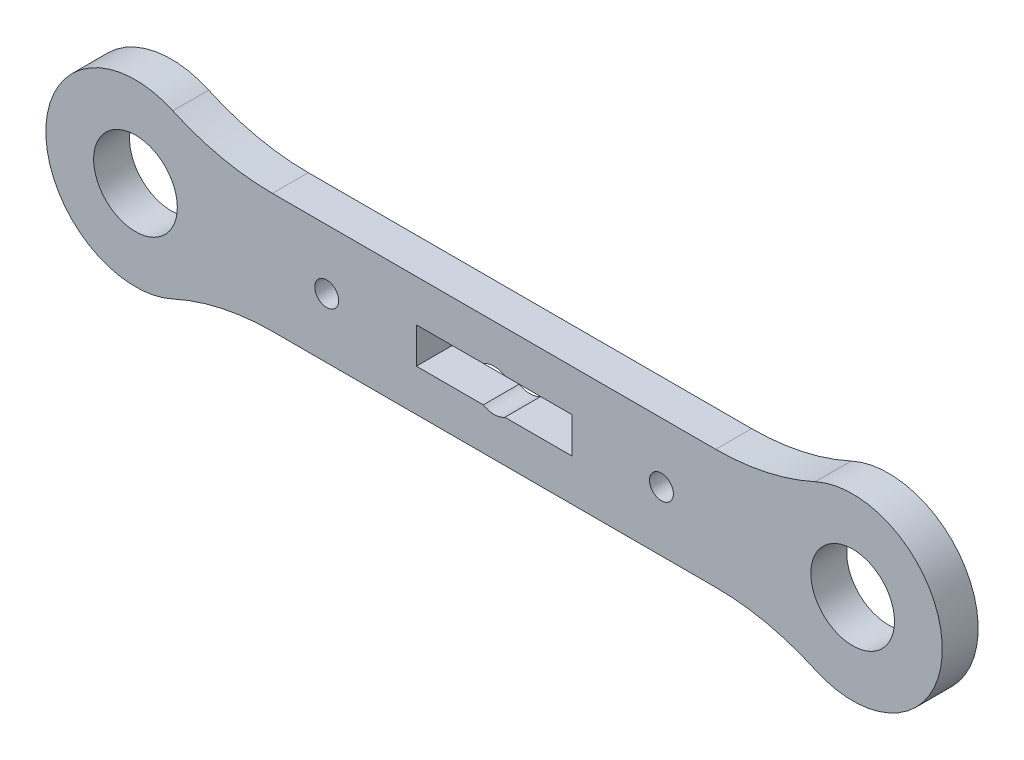
ISO-10303-21;
HEADER;
FILE_DESCRIPTION(('STEP AP214'),'2;1');
FILE_NAME('part.step','',(''),(''),'','','');
FILE_SCHEMA(('AUTOMOTIVE_DESIGN { 1 0 10303 214 1 1 1 1 }'));
ENDSEC;
DATA;
#1=APPLICATION_CONTEXT('core data for automotive mechanical design processes');
#2=APPLICATION_PROTOCOL_DEFINITION('international standard','automotive_design',2000,#1);
#3=PRODUCT_CONTEXT('',#1,'mechanical');
#4=PRODUCT('Part','Part','',(#3));
#5=PRODUCT_RELATED_PRODUCT_CATEGORY('part','',(#4));
#6=PRODUCT_DEFINITION_FORMATION('','',#4);
#7=PRODUCT_DEFINITION_CONTEXT('part definition',#1,'design');
#8=PRODUCT_DEFINITION('design','',#6,#7);
#9=PRODUCT_DEFINITION_SHAPE('','',#8);
#10=(LENGTH_UNIT() NAMED_UNIT(*) SI_UNIT(.MILLI.,.METRE.));
#11=(NAMED_UNIT(*) PLANE_ANGLE_UNIT() SI_UNIT($,.RADIAN.));
#12=(NAMED_UNIT(*) SI_UNIT($,.STERADIAN.) SOLID_ANGLE_UNIT());
#13=UNCERTAINTY_MEASURE_WITH_UNIT(LENGTH_MEASURE(1.E-05),#10,'distance_accuracy_value','');
#14=(GEOMETRIC_REPRESENTATION_CONTEXT(3) GLOBAL_UNCERTAINTY_ASSIGNED_CONTEXT((#13)) GLOBAL_UNIT_ASSIGNED_CONTEXT((#10,
#11,#12)) REPRESENTATION_CONTEXT('',''));
#15=CARTESIAN_POINT('',(0.,0.,0.));
#16=DIRECTION('',(0.,0.,1.));
#17=DIRECTION('',(1.,0.,0.));
#18=AXIS2_PLACEMENT_3D('',#15,#16,#17);
#19=CARTESIAN_POINT('',(60.,0.,3.));
#20=DIRECTION('',(0.,0.,-1.));
#21=DIRECTION('',(-1.,0.,0.));
#22=AXIS2_PLACEMENT_3D('',#19,#20,#21);
#23=CYLINDRICAL_SURFACE('',#22,7.5);
#24=CARTESIAN_POINT('',(60.,0.,3.));
#25=DIRECTION('',(0.,0.,1.));
#26=DIRECTION('',(1.,0.,0.));
#27=AXIS2_PLACEMENT_3D('',#24,#25,#26);
#28=CIRCLE('',#27,7.5);
#29=CARTESIAN_POINT('',(56.875516571621,6.81818181818182,3.));
#30=VERTEX_POINT('',#29);
#31=CARTESIAN_POINT('',(56.875516571621,-6.81818181818181,3.));
#32=VERTEX_POINT('',#31);
#33=EDGE_CURVE('E200',#30,#32,#28,.F.);
#34=ORIENTED_EDGE('',*,*,#33,.T.);
#35=DIRECTION('',(0.,0.,-1.));
#36=VECTOR('',#35,1.);
#37=CARTESIAN_POINT('',(56.875516571621,-6.81818181818181,3.));
#38=LINE('',#37,#36);
#39=CARTESIAN_POINT('',(56.875516571621,-6.81818181818181,0.));
#40=VERTEX_POINT('',#39);
#41=EDGE_CURVE('E283',#32,#40,#38,.T.);
#42=ORIENTED_EDGE('',*,*,#41,.T.);
#43=CARTESIAN_POINT('',(60.,0.,0.));
#44=DIRECTION('',(0.,0.,1.));
#45=DIRECTION('',(1.,0.,0.));
#46=AXIS2_PLACEMENT_3D('',#43,#44,#45);
#47=CIRCLE('',#46,7.5);
#48=CARTESIAN_POINT('',(56.875516571621,6.81818181818182,0.));
#49=VERTEX_POINT('',#48);
#50=EDGE_CURVE('E245',#49,#40,#47,.F.);
#51=ORIENTED_EDGE('',*,*,#50,.F.);
#52=DIRECTION('',(0.,0.,-1.));
#53=VECTOR('',#52,1.);
#54=CARTESIAN_POINT('',(56.875516571621,6.81818181818182,3.));
#55=LINE('',#54,#53);
#56=EDGE_CURVE('E281',#49,#30,#55,.F.);
#57=ORIENTED_EDGE('',*,*,#56,.T.);
#58=EDGE_LOOP('',(#34,#42,#51,#57));
#59=FACE_BOUND('',#58,.T.);
#60=ADVANCED_FACE('F35',(#59),#23,.T.);
#61=CARTESIAN_POINT('',(0.,5.,3.));
#62=DIRECTION('',(0.,1.,0.));
#63=DIRECTION('',(-1.,0.,0.));
#64=AXIS2_PLACEMENT_3D('',#61,#62,#63);
#65=PLANE('',#64);
#66=DIRECTION('',(1.,0.,0.));
#67=VECTOR('',#66,1.);
#68=CARTESIAN_POINT('',(0.,5.,3.));
#69=LINE('',#68,#67);
#70=CARTESIAN_POINT('',(11.4564392373896,5.,3.));
#71=VERTEX_POINT('',#70);
#72=CARTESIAN_POINT('',(48.5435607626104,5.00000000000001,3.));
#73=VERTEX_POINT('',#72);
#74=EDGE_CURVE('E203',#71,#73,#69,.T.);
#75=ORIENTED_EDGE('',*,*,#74,.T.);
#76=DIRECTION('',(0.,0.,1.));
#77=VECTOR('',#76,1.);
#78=CARTESIAN_POINT('',(48.5435607626104,5.00000000000001,0.));
#79=LINE('',#78,#77);
#80=CARTESIAN_POINT('',(48.5435607626104,5.00000000000001,0.));
#81=VERTEX_POINT('',#80);
#82=EDGE_CURVE('E287',#73,#81,#79,.F.);
#83=ORIENTED_EDGE('',*,*,#82,.T.);
#84=DIRECTION('',(1.,0.,0.));
#85=VECTOR('',#84,1.);
#86=CARTESIAN_POINT('',(0.,5.,0.));
#87=LINE('',#86,#85);
#88=CARTESIAN_POINT('',(11.4564392373896,5.,0.));
#89=VERTEX_POINT('',#88);
#90=EDGE_CURVE('E248',#89,#81,#87,.T.);
#91=ORIENTED_EDGE('',*,*,#90,.F.);
#92=DIRECTION('',(0.,0.,-1.));
#93=VECTOR('',#92,1.);
#94=CARTESIAN_POINT('',(11.4564392373896,5.,3.));
#95=LINE('',#94,#93);
#96=EDGE_CURVE('E57',#89,#71,#95,.F.);
#97=ORIENTED_EDGE('',*,*,#96,.T.);
#98=EDGE_LOOP('',(#75,#83,#91,#97));
#99=FACE_BOUND('',#98,.T.);
#100=ADVANCED_FACE('F306',(#99),#65,.T.);
#101=CARTESIAN_POINT('',(0.,0.,3.));
#102=DIRECTION('',(0.,0.,-1.));
#103=DIRECTION('',(-1.,0.,0.));
#104=AXIS2_PLACEMENT_3D('',#101,#102,#103);
#105=CYLINDRICAL_SURFACE('',#104,7.5);
#106=CARTESIAN_POINT('',(0.,0.,0.));
#107=DIRECTION('',(0.,0.,1.));
#108=DIRECTION('',(1.,0.,0.));
#109=AXIS2_PLACEMENT_3D('',#106,#107,#108);
#110=CIRCLE('',#109,7.5);
#111=CARTESIAN_POINT('',(3.12448342837898,6.81818181818182,0.));
#112=VERTEX_POINT('',#111);
#113=CARTESIAN_POINT('',(3.12448342837898,-6.81818181818182,0.));
#114=VERTEX_POINT('',#113);
#115=EDGE_CURVE('E251',#112,#114,#110,.T.);
#116=ORIENTED_EDGE('',*,*,#115,.T.);
#117=DIRECTION('',(0.,0.,-1.));
#118=VECTOR('',#117,1.);
#119=CARTESIAN_POINT('',(3.12448342837898,-6.81818181818182,3.));
#120=LINE('',#119,#118);
#121=CARTESIAN_POINT('',(3.12448342837898,-6.81818181818182,3.));
#122=VERTEX_POINT('',#121);
#123=EDGE_CURVE('E279',#114,#122,#120,.F.);
#124=ORIENTED_EDGE('',*,*,#123,.T.);
#125=CARTESIAN_POINT('',(0.,0.,3.));
#126=DIRECTION('',(0.,0.,1.));
#127=DIRECTION('',(1.,0.,0.));
#128=AXIS2_PLACEMENT_3D('',#125,#126,#127);
#129=CIRCLE('',#128,7.5);
#130=CARTESIAN_POINT('',(3.12448342837898,6.81818181818182,3.));
#131=VERTEX_POINT('',#130);
#132=EDGE_CURVE('E205',#131,#122,#129,.T.);
#133=ORIENTED_EDGE('',*,*,#132,.F.);
#134=DIRECTION('',(0.,0.,-1.));
#135=VECTOR('',#134,1.);
#136=CARTESIAN_POINT('',(3.12448342837898,6.81818181818182,3.));
#137=LINE('',#136,#135);
#138=EDGE_CURVE('E276',#131,#112,#137,.T.);
#139=ORIENTED_EDGE('',*,*,#138,.T.);
#140=EDGE_LOOP('',(#116,#124,#133,#139));
#141=FACE_BOUND('',#140,.T.);
#142=ADVANCED_FACE('F313',(#141),#105,.T.);
#143=CARTESIAN_POINT('',(30.,0.,3.));
#144=DIRECTION('',(0.,0.,-1.));
#145=DIRECTION('',(-1.,0.,0.));
#146=AXIS2_PLACEMENT_3D('',#143,#144,#145);
#147=CYLINDRICAL_SURFACE('',#146,1.75);
#148=CARTESIAN_POINT('',(30.,0.,0.));
#149=DIRECTION('',(0.,0.,1.));
#150=DIRECTION('',(1.,0.,0.));
#151=AXIS2_PLACEMENT_3D('',#148,#149,#150);
#152=CIRCLE('',#151,1.75);
#153=CARTESIAN_POINT('',(30.901387818866,1.5,0.));
#154=VERTEX_POINT('',#153);
#155=CARTESIAN_POINT('',(29.098612181134,1.5,0.));
#156=VERTEX_POINT('',#155);
#157=EDGE_CURVE('E155',#154,#156,#152,.T.);
#158=ORIENTED_EDGE('',*,*,#157,.F.);
#159=DIRECTION('',(0.,0.,-1.));
#160=VECTOR('',#159,1.);
#161=CARTESIAN_POINT('',(30.901387818866,1.5,3.));
#162=LINE('',#161,#160);
#163=CARTESIAN_POINT('',(30.901387818866,1.5,3.));
#164=VERTEX_POINT('',#163);
#165=EDGE_CURVE('E149',#164,#154,#162,.T.);
#166=ORIENTED_EDGE('',*,*,#165,.F.);
#167=CARTESIAN_POINT('',(30.,0.,3.));
#168=DIRECTION('',(0.,0.,1.));
#169=DIRECTION('',(1.,0.,0.));
#170=AXIS2_PLACEMENT_3D('',#167,#168,#169);
#171=CIRCLE('',#170,1.75);
#172=CARTESIAN_POINT('',(29.098612181134,1.5,3.));
#173=VERTEX_POINT('',#172);
#174=EDGE_CURVE('E153',#164,#173,#171,.T.);
#175=ORIENTED_EDGE('',*,*,#174,.T.);
#176=DIRECTION('',(0.,0.,-1.));
#177=VECTOR('',#176,1.);
#178=CARTESIAN_POINT('',(29.098612181134,1.5,3.));
#179=LINE('',#178,#177);
#180=EDGE_CURVE('E214',#173,#156,#179,.T.);
#181=ORIENTED_EDGE('',*,*,#180,.T.);
#182=EDGE_LOOP('',(#158,#166,#175,#181));
#183=FACE_BOUND('',#182,.T.);
#184=ADVANCED_FACE('F151',(#183),#147,.F.);
#185=CARTESIAN_POINT('',(0.,1.5,3.));
#186=DIRECTION('',(0.,1.,0.));
#187=DIRECTION('',(-1.,0.,0.));
#188=AXIS2_PLACEMENT_3D('',#185,#186,#187);
#189=PLANE('',#188);
#190=DIRECTION('',(1.,0.,0.));
#191=VECTOR('',#190,1.);
#192=CARTESIAN_POINT('',(0.,1.5,0.));
#193=LINE('',#192,#191);
#194=CARTESIAN_POINT('',(36.5,1.5,0.));
#195=VERTEX_POINT('',#194);
#196=EDGE_CURVE('E222',#154,#195,#193,.T.);
#197=ORIENTED_EDGE('',*,*,#196,.T.);
#198=DIRECTION('',(0.,0.,-1.));
#199=VECTOR('',#198,1.);
#200=CARTESIAN_POINT('',(36.5,1.5,3.));
#201=LINE('',#200,#199);
#202=CARTESIAN_POINT('',(36.5,1.5,3.));
#203=VERTEX_POINT('',#202);
#204=EDGE_CURVE('E160',#203,#195,#201,.T.);
#205=ORIENTED_EDGE('',*,*,#204,.F.);
#206=DIRECTION('',(1.,0.,0.));
#207=VECTOR('',#206,1.);
#208=CARTESIAN_POINT('',(0.,1.5,3.));
#209=LINE('',#208,#207);
#210=EDGE_CURVE('E164',#164,#203,#209,.T.);
#211=ORIENTED_EDGE('',*,*,#210,.F.);
#212=ORIENTED_EDGE('',*,*,#165,.T.);
#213=EDGE_LOOP('',(#197,#205,#211,#212));
#214=FACE_BOUND('',#213,.T.);
#215=ADVANCED_FACE('F165',(#214),#189,.F.);
#216=CARTESIAN_POINT('',(36.5,0.,3.));
#217=DIRECTION('',(1.,0.,0.));
#218=DIRECTION('',(0.,0.,-1.));
#219=AXIS2_PLACEMENT_3D('',#216,#217,#218);
#220=PLANE('',#219);
#221=DIRECTION('',(0.,-1.,0.));
#222=VECTOR('',#221,1.);
#223=CARTESIAN_POINT('',(36.5,0.,0.));
#224=LINE('',#223,#222);
#225=CARTESIAN_POINT('',(36.5,-1.5,0.));
#226=VERTEX_POINT('',#225);
#227=EDGE_CURVE('E224',#195,#226,#224,.T.);
#228=ORIENTED_EDGE('',*,*,#227,.T.);
#229=DIRECTION('',(0.,0.,-1.));
#230=VECTOR('',#229,1.);
#231=CARTESIAN_POINT('',(36.5,-1.5,3.));
#232=LINE('',#231,#230);
#233=CARTESIAN_POINT('',(36.5,-1.5,3.));
#234=VERTEX_POINT('',#233);
#235=EDGE_CURVE('E269',#234,#226,#232,.T.);
#236=ORIENTED_EDGE('',*,*,#235,.F.);
#237=DIRECTION('',(0.,-1.,0.));
#238=VECTOR('',#237,1.);
#239=CARTESIAN_POINT('',(36.5,0.,3.));
#240=LINE('',#239,#238);
#241=EDGE_CURVE('E168',#203,#234,#240,.T.);
#242=ORIENTED_EDGE('',*,*,#241,.F.);
#243=ORIENTED_EDGE('',*,*,#204,.T.);
#244=EDGE_LOOP('',(#228,#236,#242,#243));
#245=FACE_BOUND('',#244,.T.);
#246=ADVANCED_FACE('F370',(#245),#220,.F.);
#247=CARTESIAN_POINT('',(0.,-1.5,3.));
#248=DIRECTION('',(0.,1.,0.));
#249=DIRECTION('',(-1.,0.,0.));
#250=AXIS2_PLACEMENT_3D('',#247,#248,#249);
#251=PLANE('',#250);
#252=DIRECTION('',(1.,0.,0.));
#253=VECTOR('',#252,1.);
#254=CARTESIAN_POINT('',(0.,-1.5,0.));
#255=LINE('',#254,#253);
#256=CARTESIAN_POINT('',(30.901387818866,-1.5,0.));
#257=VERTEX_POINT('',#256);
#258=EDGE_CURVE('E227',#257,#226,#255,.T.);
#259=ORIENTED_EDGE('',*,*,#258,.F.);
#260=DIRECTION('',(0.,0.,-1.));
#261=VECTOR('',#260,1.);
#262=CARTESIAN_POINT('',(30.901387818866,-1.5,3.));
#263=LINE('',#262,#261);
#264=CARTESIAN_POINT('',(30.901387818866,-1.5,3.));
#265=VERTEX_POINT('',#264);
#266=EDGE_CURVE('E267',#265,#257,#263,.T.);
#267=ORIENTED_EDGE('',*,*,#266,.F.);
#268=DIRECTION('',(1.,0.,0.));
#269=VECTOR('',#268,1.);
#270=CARTESIAN_POINT('',(0.,-1.5,3.));
#271=LINE('',#270,#269);
#272=EDGE_CURVE('E184',#265,#234,#271,.T.);
#273=ORIENTED_EDGE('',*,*,#272,.T.);
#274=ORIENTED_EDGE('',*,*,#235,.T.);
#275=EDGE_LOOP('',(#259,#267,#273,#274));
#276=FACE_BOUND('',#275,.T.);
#277=ADVANCED_FACE('F366',(#276),#251,.T.);
#278=CARTESIAN_POINT('',(30.,0.,3.));
#279=DIRECTION('',(0.,0.,-1.));
#280=DIRECTION('',(-1.,0.,0.));
#281=AXIS2_PLACEMENT_3D('',#278,#279,#280);
#282=CYLINDRICAL_SURFACE('',#281,1.75);
#283=CARTESIAN_POINT('',(30.,0.,0.));
#284=DIRECTION('',(0.,0.,1.));
#285=DIRECTION('',(1.,0.,0.));
#286=AXIS2_PLACEMENT_3D('',#283,#284,#285);
#287=CIRCLE('',#286,1.75);
#288=CARTESIAN_POINT('',(29.098612181134,-1.5,0.));
#289=VERTEX_POINT('',#288);
#290=EDGE_CURVE('E230',#289,#257,#287,.T.);
#291=ORIENTED_EDGE('',*,*,#290,.F.);
#292=DIRECTION('',(0.,0.,-1.));
#293=VECTOR('',#292,1.);
#294=CARTESIAN_POINT('',(29.098612181134,-1.5,3.));
#295=LINE('',#294,#293);
#296=CARTESIAN_POINT('',(29.098612181134,-1.5,3.));
#297=VERTEX_POINT('',#296);
#298=EDGE_CURVE('E265',#297,#289,#295,.T.);
#299=ORIENTED_EDGE('',*,*,#298,.F.);
#300=CARTESIAN_POINT('',(30.,0.,3.));
#301=DIRECTION('',(0.,0.,1.));
#302=DIRECTION('',(1.,0.,0.));
#303=AXIS2_PLACEMENT_3D('',#300,#301,#302);
#304=CIRCLE('',#303,1.75);
#305=EDGE_CURVE('E187',#297,#265,#304,.T.);
#306=ORIENTED_EDGE('',*,*,#305,.T.);
#307=ORIENTED_EDGE('',*,*,#266,.T.);
#308=EDGE_LOOP('',(#291,#299,#306,#307));
#309=FACE_BOUND('',#308,.T.);
#310=ADVANCED_FACE('F362',(#309),#282,.F.);
#311=CARTESIAN_POINT('',(0.,-1.5,3.));
#312=DIRECTION('',(0.,1.,0.));
#313=DIRECTION('',(-1.,0.,0.));
#314=AXIS2_PLACEMENT_3D('',#311,#312,#313);
#315=PLANE('',#314);
#316=DIRECTION('',(1.,0.,0.));
#317=VECTOR('',#316,1.);
#318=CARTESIAN_POINT('',(0.,-1.5,0.));
#319=LINE('',#318,#317);
#320=CARTESIAN_POINT('',(23.5,-1.5,0.));
#321=VERTEX_POINT('',#320);
#322=EDGE_CURVE('E233',#321,#289,#319,.T.);
#323=ORIENTED_EDGE('',*,*,#322,.F.);
#324=DIRECTION('',(0.,0.,-1.));
#325=VECTOR('',#324,1.);
#326=CARTESIAN_POINT('',(23.5,-1.5,3.));
#327=LINE('',#326,#325);
#328=CARTESIAN_POINT('',(23.5,-1.5,3.));
#329=VERTEX_POINT('',#328);
#330=EDGE_CURVE('E263',#329,#321,#327,.T.);
#331=ORIENTED_EDGE('',*,*,#330,.F.);
#332=DIRECTION('',(1.,0.,0.));
#333=VECTOR('',#332,1.);
#334=CARTESIAN_POINT('',(0.,-1.5,3.));
#335=LINE('',#334,#333);
#336=EDGE_CURVE('E190',#329,#297,#335,.T.);
#337=ORIENTED_EDGE('',*,*,#336,.T.);
#338=ORIENTED_EDGE('',*,*,#298,.T.);
#339=EDGE_LOOP('',(#323,#331,#337,#338));
#340=FACE_BOUND('',#339,.T.);
#341=ADVANCED_FACE('F358',(#340),#315,.T.);
#342=CARTESIAN_POINT('',(23.5,0.,3.));
#343=DIRECTION('',(1.,0.,0.));
#344=DIRECTION('',(0.,0.,-1.));
#345=AXIS2_PLACEMENT_3D('',#342,#343,#344);
#346=PLANE('',#345);
#347=DIRECTION('',(0.,-1.,0.));
#348=VECTOR('',#347,1.);
#349=CARTESIAN_POINT('',(23.5,0.,0.));
#350=LINE('',#349,#348);
#351=CARTESIAN_POINT('',(23.5,1.5,0.));
#352=VERTEX_POINT('',#351);
#353=EDGE_CURVE('E236',#352,#321,#350,.T.);
#354=ORIENTED_EDGE('',*,*,#353,.F.);
#355=DIRECTION('',(0.,0.,-1.));
#356=VECTOR('',#355,1.);
#357=CARTESIAN_POINT('',(23.5,1.5,3.));
#358=LINE('',#357,#356);
#359=CARTESIAN_POINT('',(23.5,1.5,3.));
#360=VERTEX_POINT('',#359);
#361=EDGE_CURVE('E261',#360,#352,#358,.T.);
#362=ORIENTED_EDGE('',*,*,#361,.F.);
#363=DIRECTION('',(0.,-1.,0.));
#364=VECTOR('',#363,1.);
#365=CARTESIAN_POINT('',(23.5,0.,3.));
#366=LINE('',#365,#364);
#367=EDGE_CURVE('E193',#360,#329,#366,.T.);
#368=ORIENTED_EDGE('',*,*,#367,.T.);
#369=ORIENTED_EDGE('',*,*,#330,.T.);
#370=EDGE_LOOP('',(#354,#362,#368,#369));
#371=FACE_BOUND('',#370,.T.);
#372=ADVANCED_FACE('F355',(#371),#346,.T.);
#373=CARTESIAN_POINT('',(0.,-5.,3.));
#374=DIRECTION('',(0.,1.,0.));
#375=DIRECTION('',(-1.,0.,0.));
#376=AXIS2_PLACEMENT_3D('',#373,#374,#375);
#377=PLANE('',#376);
#378=DIRECTION('',(1.,0.,0.));
#379=VECTOR('',#378,1.);
#380=CARTESIAN_POINT('',(0.,-5.,3.));
#381=LINE('',#380,#379);
#382=CARTESIAN_POINT('',(11.4564392373896,-5.,3.));
#383=VERTEX_POINT('',#382);
#384=CARTESIAN_POINT('',(48.5435607626104,-4.99999999999999,3.));
#385=VERTEX_POINT('',#384);
#386=EDGE_CURVE('E208',#383,#385,#381,.T.);
#387=ORIENTED_EDGE('',*,*,#386,.F.);
#388=DIRECTION('',(0.,0.,1.));
#389=VECTOR('',#388,1.);
#390=CARTESIAN_POINT('',(11.4564392373896,-5.,0.));
#391=LINE('',#390,#389);
#392=CARTESIAN_POINT('',(11.4564392373896,-5.,0.));
#393=VERTEX_POINT('',#392);
#394=EDGE_CURVE('E273',#383,#393,#391,.F.);
#395=ORIENTED_EDGE('',*,*,#394,.T.);
#396=DIRECTION('',(1.,0.,0.));
#397=VECTOR('',#396,1.);
#398=CARTESIAN_POINT('',(0.,-5.,0.));
#399=LINE('',#398,#397);
#400=CARTESIAN_POINT('',(48.5435607626104,-4.99999999999999,0.));
#401=VERTEX_POINT('',#400);
#402=EDGE_CURVE('E254',#393,#401,#399,.T.);
#403=ORIENTED_EDGE('',*,*,#402,.T.);
#404=DIRECTION('',(0.,0.,-1.));
#405=VECTOR('',#404,1.);
#406=CARTESIAN_POINT('',(48.5435607626104,-4.99999999999999,3.));
#407=LINE('',#406,#405);
#408=EDGE_CURVE('E159',#401,#385,#407,.F.);
#409=ORIENTED_EDGE('',*,*,#408,.T.);
#410=EDGE_LOOP('',(#387,#395,#403,#409));
#411=FACE_BOUND('',#410,.T.);
#412=ADVANCED_FACE('F321',(#411),#377,.F.);
#413=CARTESIAN_POINT('',(0.,0.,3.));
#414=DIRECTION('',(0.,0.,-1.));
#415=DIRECTION('',(-1.,0.,0.));
#416=AXIS2_PLACEMENT_3D('',#413,#414,#415);
#417=CYLINDRICAL_SURFACE('',#416,3.5);
#418=CARTESIAN_POINT('',(0.,0.,3.));
#419=DIRECTION('',(0.,0.,1.));
#420=DIRECTION('',(1.,0.,0.));
#421=AXIS2_PLACEMENT_3D('',#418,#419,#420);
#422=CIRCLE('',#421,3.5);
#423=CARTESIAN_POINT('',(3.5,0.,3.));
#424=VERTEX_POINT('',#423);
#425=EDGE_CURVE('E197',#424,#424,#422,.T.);
#426=ORIENTED_EDGE('',*,*,#425,.T.);
#427=EDGE_LOOP('',(#426));
#428=FACE_BOUND('',#427,.T.);
#429=CARTESIAN_POINT('',(0.,0.,0.));
#430=DIRECTION('',(0.,0.,1.));
#431=DIRECTION('',(1.,0.,0.));
#432=AXIS2_PLACEMENT_3D('',#429,#430,#431);
#433=CIRCLE('',#432,3.5);
#434=CARTESIAN_POINT('',(3.5,0.,0.));
#435=VERTEX_POINT('',#434);
#436=EDGE_CURVE('E242',#435,#435,#433,.T.);
#437=ORIENTED_EDGE('',*,*,#436,.F.);
#438=EDGE_LOOP('',(#437));
#439=FACE_BOUND('',#438,.T.);
#440=ADVANCED_FACE('F346',(#428,#439),#417,.F.);
#441=CARTESIAN_POINT('',(0.,1.5,3.));
#442=DIRECTION('',(0.,1.,0.));
#443=DIRECTION('',(-1.,0.,0.));
#444=AXIS2_PLACEMENT_3D('',#441,#442,#443);
#445=PLANE('',#444);
#446=DIRECTION('',(1.,0.,0.));
#447=VECTOR('',#446,1.);
#448=CARTESIAN_POINT('',(0.,1.5,0.));
#449=LINE('',#448,#447);
#450=EDGE_CURVE('E239',#352,#156,#449,.T.);
#451=ORIENTED_EDGE('',*,*,#450,.T.);
#452=ORIENTED_EDGE('',*,*,#180,.F.);
#453=DIRECTION('',(1.,0.,0.));
#454=VECTOR('',#453,1.);
#455=CARTESIAN_POINT('',(0.,1.5,3.));
#456=LINE('',#455,#454);
#457=EDGE_CURVE('E174',#360,#173,#456,.T.);
#458=ORIENTED_EDGE('',*,*,#457,.F.);
#459=ORIENTED_EDGE('',*,*,#361,.T.);
#460=EDGE_LOOP('',(#451,#452,#458,#459));
#461=FACE_BOUND('',#460,.T.);
#462=ADVANCED_FACE('F349',(#461),#445,.F.);
#463=CARTESIAN_POINT('',(16.,0.,3.));
#464=DIRECTION('',(0.,0.,-1.));
#465=DIRECTION('',(-1.,0.,0.));
#466=AXIS2_PLACEMENT_3D('',#463,#464,#465);
#467=CYLINDRICAL_SURFACE('',#466,0.999999999999998);
#468=CARTESIAN_POINT('',(16.,0.,3.));
#469=DIRECTION('',(0.,0.,1.));
#470=DIRECTION('',(1.,0.,0.));
#471=AXIS2_PLACEMENT_3D('',#468,#469,#470);
#472=CIRCLE('',#471,0.999999999999998);
#473=CARTESIAN_POINT('',(17.,0.,3.));
#474=VERTEX_POINT('',#473);
#475=EDGE_CURVE('E176',#474,#474,#472,.T.);
#476=ORIENTED_EDGE('',*,*,#475,.T.);
#477=EDGE_LOOP('',(#476));
#478=FACE_BOUND('',#477,.T.);
#479=CARTESIAN_POINT('',(16.,0.,0.));
#480=DIRECTION('',(0.,0.,1.));
#481=DIRECTION('',(1.,0.,0.));
#482=AXIS2_PLACEMENT_3D('',#479,#480,#481);
#483=CIRCLE('',#482,0.999999999999998);
#484=CARTESIAN_POINT('',(17.,0.,0.));
#485=VERTEX_POINT('',#484);
#486=EDGE_CURVE('E218',#485,#485,#483,.T.);
#487=ORIENTED_EDGE('',*,*,#486,.F.);
#488=EDGE_LOOP('',(#487));
#489=FACE_BOUND('',#488,.T.);
#490=ADVANCED_FACE('F353',(#478,#489),#467,.F.);
#491=CARTESIAN_POINT('',(44.,0.,3.));
#492=DIRECTION('',(0.,0.,-1.));
#493=DIRECTION('',(-1.,0.,0.));
#494=AXIS2_PLACEMENT_3D('',#491,#492,#493);
#495=CYLINDRICAL_SURFACE('',#494,0.999999999999998);
#496=CARTESIAN_POINT('',(44.,0.,3.));
#497=DIRECTION('',(0.,0.,1.));
#498=DIRECTION('',(1.,0.,0.));
#499=AXIS2_PLACEMENT_3D('',#496,#497,#498);
#500=CIRCLE('',#499,0.999999999999998);
#501=CARTESIAN_POINT('',(45.,0.,3.));
#502=VERTEX_POINT('',#501);
#503=EDGE_CURVE('E179',#502,#502,#500,.F.);
#504=ORIENTED_EDGE('',*,*,#503,.F.);
#505=EDGE_LOOP('',(#504));
#506=FACE_BOUND('',#505,.T.);
#507=CARTESIAN_POINT('',(44.,0.,0.));
#508=DIRECTION('',(0.,0.,1.));
#509=DIRECTION('',(1.,0.,0.));
#510=AXIS2_PLACEMENT_3D('',#507,#508,#509);
#511=CIRCLE('',#510,0.999999999999998);
#512=CARTESIAN_POINT('',(45.,0.,0.));
#513=VERTEX_POINT('',#512);
#514=EDGE_CURVE('E215',#513,#513,#511,.F.);
#515=ORIENTED_EDGE('',*,*,#514,.T.);
#516=EDGE_LOOP('',(#515));
#517=FACE_BOUND('',#516,.T.);
#518=ADVANCED_FACE('F381',(#506,#517),#495,.F.);
#519=CARTESIAN_POINT('',(60.,0.,3.));
#520=DIRECTION('',(0.,0.,-1.));
#521=DIRECTION('',(-1.,0.,0.));
#522=AXIS2_PLACEMENT_3D('',#519,#520,#521);
#523=CYLINDRICAL_SURFACE('',#522,3.50000000000001);
#524=CARTESIAN_POINT('',(60.,0.,3.));
#525=DIRECTION('',(0.,0.,1.));
#526=DIRECTION('',(1.,0.,0.));
#527=AXIS2_PLACEMENT_3D('',#524,#525,#526);
#528=CIRCLE('',#527,3.50000000000001);
#529=CARTESIAN_POINT('',(63.5,0.,3.));
#530=VERTEX_POINT('',#529);
#531=EDGE_CURVE('E211',#530,#530,#528,.F.);
#532=ORIENTED_EDGE('',*,*,#531,.F.);
#533=EDGE_LOOP('',(#532));
#534=FACE_BOUND('',#533,.T.);
#535=CARTESIAN_POINT('',(60.,0.,0.));
#536=DIRECTION('',(0.,0.,1.));
#537=DIRECTION('',(1.,0.,0.));
#538=AXIS2_PLACEMENT_3D('',#535,#536,#537);
#539=CIRCLE('',#538,3.50000000000001);
#540=CARTESIAN_POINT('',(63.5,0.,0.));
#541=VERTEX_POINT('',#540);
#542=EDGE_CURVE('E257',#541,#541,#539,.F.);
#543=ORIENTED_EDGE('',*,*,#542,.T.);
#544=EDGE_LOOP('',(#543));
#545=FACE_BOUND('',#544,.T.);
#546=ADVANCED_FACE('F385',(#534,#545),#523,.F.);
#547=CARTESIAN_POINT('',(0.,0.,3.));
#548=DIRECTION('',(0.,0.,1.));
#549=DIRECTION('',(1.,0.,0.));
#550=AXIS2_PLACEMENT_3D('',#547,#548,#549);
#551=PLANE('',#550);
#552=ORIENTED_EDGE('',*,*,#503,.T.);
#553=EDGE_LOOP('',(#552));
#554=FACE_BOUND('',#553,.T.);
#555=ORIENTED_EDGE('',*,*,#475,.F.);
#556=EDGE_LOOP('',(#555));
#557=FACE_BOUND('',#556,.T.);
#558=ORIENTED_EDGE('',*,*,#174,.F.);
#559=ORIENTED_EDGE('',*,*,#210,.T.);
#560=ORIENTED_EDGE('',*,*,#241,.T.);
#561=ORIENTED_EDGE('',*,*,#272,.F.);
#562=ORIENTED_EDGE('',*,*,#305,.F.);
#563=ORIENTED_EDGE('',*,*,#336,.F.);
#564=ORIENTED_EDGE('',*,*,#367,.F.);
#565=ORIENTED_EDGE('',*,*,#457,.T.);
#566=EDGE_LOOP('',(#558,#559,#560,#561,#562,#563,#564,#565));
#567=FACE_BOUND('',#566,.T.);
#568=ORIENTED_EDGE('',*,*,#425,.F.);
#569=EDGE_LOOP('',(#568));
#570=FACE_BOUND('',#569,.T.);
#571=ORIENTED_EDGE('',*,*,#33,.F.);
#572=CARTESIAN_POINT('',(48.5435607626104,25.,3.));
#573=DIRECTION('',(0.,0.,1.));
#574=DIRECTION('',(1.,0.,0.));
#575=AXIS2_PLACEMENT_3D('',#572,#573,#574);
#576=CIRCLE('',#575,20.);
#577=EDGE_CURVE('E50',#30,#73,#576,.F.);
#578=ORIENTED_EDGE('',*,*,#577,.T.);
#579=ORIENTED_EDGE('',*,*,#74,.F.);
#580=CARTESIAN_POINT('',(11.4564392373896,25.,3.));
#581=DIRECTION('',(0.,0.,1.));
#582=DIRECTION('',(1.,0.,0.));
#583=AXIS2_PLACEMENT_3D('',#580,#581,#582);
#584=CIRCLE('',#583,20.);
#585=EDGE_CURVE('E11',#71,#131,#584,.F.);
#586=ORIENTED_EDGE('',*,*,#585,.T.);
#587=ORIENTED_EDGE('',*,*,#132,.T.);
#588=CARTESIAN_POINT('',(11.4564392373896,-25.,3.));
#589=DIRECTION('',(0.,0.,1.));
#590=DIRECTION('',(1.,0.,0.));
#591=AXIS2_PLACEMENT_3D('',#588,#589,#590);
#592=CIRCLE('',#591,20.);
#593=EDGE_CURVE('E292',#122,#383,#592,.F.);
#594=ORIENTED_EDGE('',*,*,#593,.T.);
#595=ORIENTED_EDGE('',*,*,#386,.T.);
#596=CARTESIAN_POINT('',(48.5435607626104,-25.,3.));
#597=DIRECTION('',(0.,0.,1.));
#598=DIRECTION('',(1.,0.,0.));
#599=AXIS2_PLACEMENT_3D('',#596,#597,#598);
#600=CIRCLE('',#599,20.);
#601=EDGE_CURVE('E296',#385,#32,#600,.F.);
#602=ORIENTED_EDGE('',*,*,#601,.T.);
#603=EDGE_LOOP('',(#571,#578,#579,#586,#587,#594,#595,#602));
#604=FACE_BOUND('',#603,.T.);
#605=ORIENTED_EDGE('',*,*,#531,.T.);
#606=EDGE_LOOP('',(#605));
#607=FACE_BOUND('',#606,.T.);
#608=ADVANCED_FACE('F170',(#554,#557,#567,#570,#604,#607),#551,.T.);
#609=CARTESIAN_POINT('',(0.,0.,0.));
#610=DIRECTION('',(0.,0.,1.));
#611=DIRECTION('',(1.,0.,0.));
#612=AXIS2_PLACEMENT_3D('',#609,#610,#611);
#613=PLANE('',#612);
#614=ORIENTED_EDGE('',*,*,#514,.F.);
#615=EDGE_LOOP('',(#614));
#616=FACE_BOUND('',#615,.T.);
#617=ORIENTED_EDGE('',*,*,#486,.T.);
#618=EDGE_LOOP('',(#617));
#619=FACE_BOUND('',#618,.T.);
#620=ORIENTED_EDGE('',*,*,#157,.T.);
#621=ORIENTED_EDGE('',*,*,#450,.F.);
#622=ORIENTED_EDGE('',*,*,#353,.T.);
#623=ORIENTED_EDGE('',*,*,#322,.T.);
#624=ORIENTED_EDGE('',*,*,#290,.T.);
#625=ORIENTED_EDGE('',*,*,#258,.T.);
#626=ORIENTED_EDGE('',*,*,#227,.F.);
#627=ORIENTED_EDGE('',*,*,#196,.F.);
#628=EDGE_LOOP('',(#620,#621,#622,#623,#624,#625,#626,#627));
#629=FACE_BOUND('',#628,.T.);
#630=ORIENTED_EDGE('',*,*,#436,.T.);
#631=EDGE_LOOP('',(#630));
#632=FACE_BOUND('',#631,.T.);
#633=ORIENTED_EDGE('',*,*,#90,.T.);
#634=CARTESIAN_POINT('',(48.5435607626104,25.,0.));
#635=DIRECTION('',(0.,0.,1.));
#636=DIRECTION('',(1.,0.,0.));
#637=AXIS2_PLACEMENT_3D('',#634,#635,#636);
#638=CIRCLE('',#637,20.);
#639=EDGE_CURVE('E298',#81,#49,#638,.T.);
#640=ORIENTED_EDGE('',*,*,#639,.T.);
#641=ORIENTED_EDGE('',*,*,#50,.T.);
#642=CARTESIAN_POINT('',(48.5435607626104,-25.,0.));
#643=DIRECTION('',(0.,0.,1.));
#644=DIRECTION('',(1.,0.,0.));
#645=AXIS2_PLACEMENT_3D('',#642,#643,#644);
#646=CIRCLE('',#645,20.);
#647=EDGE_CURVE('E294',#40,#401,#646,.T.);
#648=ORIENTED_EDGE('',*,*,#647,.T.);
#649=ORIENTED_EDGE('',*,*,#402,.F.);
#650=CARTESIAN_POINT('',(11.4564392373896,-25.,0.));
#651=DIRECTION('',(0.,0.,1.));
#652=DIRECTION('',(1.,0.,0.));
#653=AXIS2_PLACEMENT_3D('',#650,#651,#652);
#654=CIRCLE('',#653,20.);
#655=EDGE_CURVE('E290',#393,#114,#654,.T.);
#656=ORIENTED_EDGE('',*,*,#655,.T.);
#657=ORIENTED_EDGE('',*,*,#115,.F.);
#658=CARTESIAN_POINT('',(11.4564392373896,25.,0.));
#659=DIRECTION('',(0.,0.,1.));
#660=DIRECTION('',(1.,0.,0.));
#661=AXIS2_PLACEMENT_3D('',#658,#659,#660);
#662=CIRCLE('',#661,20.);
#663=EDGE_CURVE('E43',#112,#89,#662,.T.);
#664=ORIENTED_EDGE('',*,*,#663,.T.);
#665=EDGE_LOOP('',(#633,#640,#641,#648,#649,#656,#657,#664));
#666=FACE_BOUND('',#665,.T.);
#667=ORIENTED_EDGE('',*,*,#542,.F.);
#668=EDGE_LOOP('',(#667));
#669=FACE_BOUND('',#668,.T.);
#670=ADVANCED_FACE('F302',(#616,#619,#629,#632,#666,#669),#613,.F.);
#671=CARTESIAN_POINT('',(11.4564392373896,-25.,3.));
#672=DIRECTION('',(0.,0.,-1.));
#673=DIRECTION('',(-1.,0.,0.));
#674=AXIS2_PLACEMENT_3D('',#671,#672,#673);
#675=CYLINDRICAL_SURFACE('',#674,20.);
#676=ORIENTED_EDGE('',*,*,#593,.F.);
#677=ORIENTED_EDGE('',*,*,#123,.F.);
#678=ORIENTED_EDGE('',*,*,#655,.F.);
#679=ORIENTED_EDGE('',*,*,#394,.F.);
#680=EDGE_LOOP('',(#676,#677,#678,#679));
#681=FACE_BOUND('',#680,.T.);
#682=ADVANCED_FACE('F316',(#681),#675,.F.);
#683=CARTESIAN_POINT('',(48.5435607626104,-25.,3.));
#684=DIRECTION('',(0.,0.,-1.));
#685=DIRECTION('',(-1.,0.,0.));
#686=AXIS2_PLACEMENT_3D('',#683,#684,#685);
#687=CYLINDRICAL_SURFACE('',#686,20.);
#688=ORIENTED_EDGE('',*,*,#601,.F.);
#689=ORIENTED_EDGE('',*,*,#408,.F.);
#690=ORIENTED_EDGE('',*,*,#647,.F.);
#691=ORIENTED_EDGE('',*,*,#41,.F.);
#692=EDGE_LOOP('',(#688,#689,#690,#691));
#693=FACE_BOUND('',#692,.T.);
#694=ADVANCED_FACE('F325',(#693),#687,.F.);
#695=CARTESIAN_POINT('',(48.5435607626104,25.,3.));
#696=DIRECTION('',(0.,0.,-1.));
#697=DIRECTION('',(-1.,0.,0.));
#698=AXIS2_PLACEMENT_3D('',#695,#696,#697);
#699=CYLINDRICAL_SURFACE('',#698,20.);
#700=ORIENTED_EDGE('',*,*,#577,.F.);
#701=ORIENTED_EDGE('',*,*,#56,.F.);
#702=ORIENTED_EDGE('',*,*,#639,.F.);
#703=ORIENTED_EDGE('',*,*,#82,.F.);
#704=EDGE_LOOP('',(#700,#701,#702,#703));
#705=FACE_BOUND('',#704,.T.);
#706=ADVANCED_FACE('F331',(#705),#699,.F.);
#707=CARTESIAN_POINT('',(11.4564392373896,25.,3.));
#708=DIRECTION('',(0.,0.,-1.));
#709=DIRECTION('',(-1.,0.,0.));
#710=AXIS2_PLACEMENT_3D('',#707,#708,#709);
#711=CYLINDRICAL_SURFACE('',#710,20.);
#712=ORIENTED_EDGE('',*,*,#585,.F.);
#713=ORIENTED_EDGE('',*,*,#96,.F.);
#714=ORIENTED_EDGE('',*,*,#663,.F.);
#715=ORIENTED_EDGE('',*,*,#138,.F.);
#716=EDGE_LOOP('',(#712,#713,#714,#715));
#717=FACE_BOUND('',#716,.T.);
#718=ADVANCED_FACE('F37',(#717),#711,.F.);
#719=CLOSED_SHELL('',(#60,#100,#142,#184,#215,#246,#277,#310,#341,#372,#412,#440,#462,#490,#518,
#546,#608,#670,#682,#694,#706,#718));
#720=MANIFOLD_SOLID_BREP('B2',#719);
#721=ADVANCED_BREP_SHAPE_REPRESENTATION('',(#18,#720),#14);
#722=SHAPE_DEFINITION_REPRESENTATION(#9,#721);
ENDSEC;
END-ISO-10303-21;
